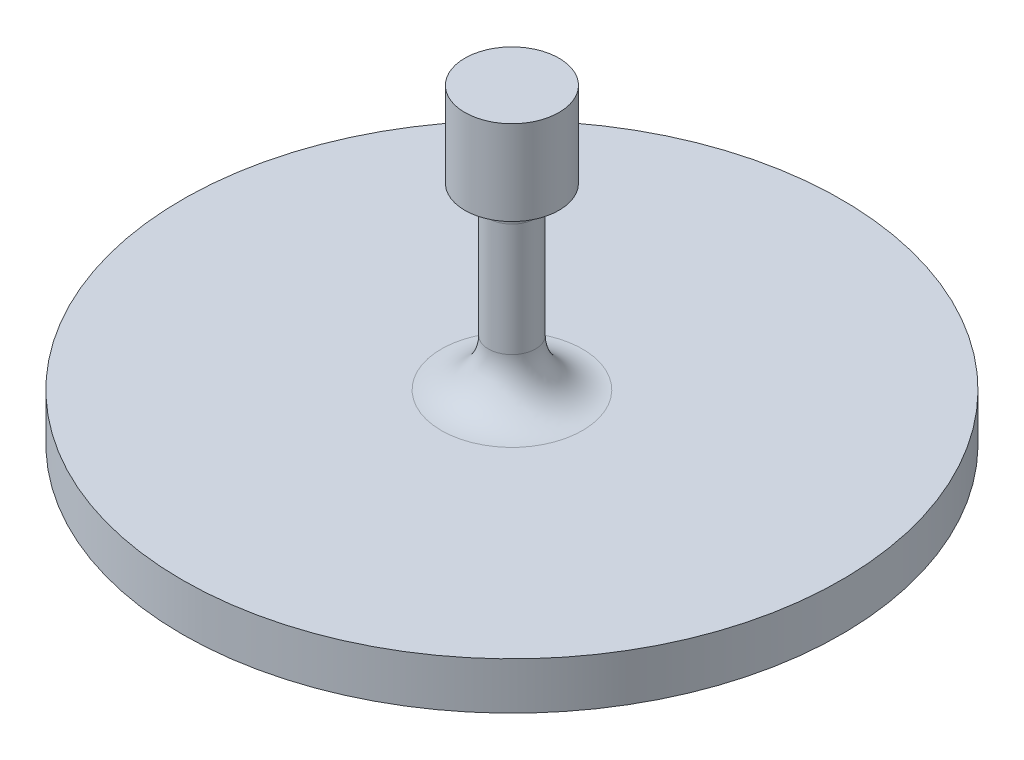
ISO-10303-21;
HEADER;
FILE_DESCRIPTION(('STEP AP214'),'2;1');
FILE_NAME('part.step','',(''),(''),'','','');
FILE_SCHEMA(('AUTOMOTIVE_DESIGN { 1 0 10303 214 1 1 1 1 }'));
ENDSEC;
DATA;
#1=APPLICATION_CONTEXT('core data for automotive mechanical design processes');
#2=APPLICATION_PROTOCOL_DEFINITION('international standard','automotive_design',2000,#1);
#3=PRODUCT_CONTEXT('',#1,'mechanical');
#4=PRODUCT('Part','Part','',(#3));
#5=PRODUCT_RELATED_PRODUCT_CATEGORY('part','',(#4));
#6=PRODUCT_DEFINITION_FORMATION('','',#4);
#7=PRODUCT_DEFINITION_CONTEXT('part definition',#1,'design');
#8=PRODUCT_DEFINITION('design','',#6,#7);
#9=PRODUCT_DEFINITION_SHAPE('','',#8);
#10=(LENGTH_UNIT() NAMED_UNIT(*) SI_UNIT(.MILLI.,.METRE.));
#11=(NAMED_UNIT(*) PLANE_ANGLE_UNIT() SI_UNIT($,.RADIAN.));
#12=(NAMED_UNIT(*) SI_UNIT($,.STERADIAN.) SOLID_ANGLE_UNIT());
#13=UNCERTAINTY_MEASURE_WITH_UNIT(LENGTH_MEASURE(1.E-05),#10,'distance_accuracy_value','');
#14=(GEOMETRIC_REPRESENTATION_CONTEXT(3) GLOBAL_UNCERTAINTY_ASSIGNED_CONTEXT((#13)) GLOBAL_UNIT_ASSIGNED_CONTEXT((#10,
#11,#12)) REPRESENTATION_CONTEXT('',''));
#15=CARTESIAN_POINT('',(0.,0.,0.));
#16=DIRECTION('',(0.,0.,1.));
#17=DIRECTION('',(1.,0.,0.));
#18=AXIS2_PLACEMENT_3D('',#15,#16,#17);
#19=CARTESIAN_POINT('',(0.,5.,0.));
#20=DIRECTION('',(0.,-1.,0.));
#21=DIRECTION('',(0.,0.,-1.));
#22=AXIS2_PLACEMENT_3D('',#19,#20,#21);
#23=CYLINDRICAL_SURFACE('',#22,35.);
#24=CARTESIAN_POINT('',(0.,5.,0.));
#25=DIRECTION('',(0.,1.,0.));
#26=DIRECTION('',(0.,0.,1.));
#27=AXIS2_PLACEMENT_3D('',#24,#25,#26);
#28=CIRCLE('',#27,35.);
#29=CARTESIAN_POINT('',(0.,5.,35.));
#30=VERTEX_POINT('',#29);
#31=EDGE_CURVE('E61',#30,#30,#28,.T.);
#32=ORIENTED_EDGE('',*,*,#31,.F.);
#33=EDGE_LOOP('',(#32));
#34=FACE_BOUND('',#33,.T.);
#35=CARTESIAN_POINT('',(0.,0.,0.));
#36=DIRECTION('',(0.,1.,0.));
#37=DIRECTION('',(0.,0.,1.));
#38=AXIS2_PLACEMENT_3D('',#35,#36,#37);
#39=CIRCLE('',#38,35.);
#40=CARTESIAN_POINT('',(0.,0.,35.));
#41=VERTEX_POINT('',#40);
#42=EDGE_CURVE('E62',#41,#41,#39,.T.);
#43=ORIENTED_EDGE('',*,*,#42,.T.);
#44=EDGE_LOOP('',(#43));
#45=FACE_BOUND('',#44,.T.);
#46=ADVANCED_FACE('F41',(#34,#45),#23,.T.);
#47=CARTESIAN_POINT('',(0.,5.,0.));
#48=DIRECTION('',(0.,1.,0.));
#49=DIRECTION('',(0.,0.,1.));
#50=AXIS2_PLACEMENT_3D('',#47,#48,#49);
#51=PLANE('',#50);
#52=CARTESIAN_POINT('',(0.,5.,0.));
#53=DIRECTION('',(0.,1.,0.));
#54=DIRECTION('',(0.,0.,1.));
#55=AXIS2_PLACEMENT_3D('',#52,#53,#54);
#56=CIRCLE('',#55,7.5);
#57=CARTESIAN_POINT('',(0.,5.,7.5));
#58=VERTEX_POINT('',#57);
#59=EDGE_CURVE('E52',#58,#58,#56,.F.);
#60=ORIENTED_EDGE('',*,*,#59,.T.);
#61=EDGE_LOOP('',(#60));
#62=FACE_BOUND('',#61,.T.);
#63=ORIENTED_EDGE('',*,*,#31,.T.);
#64=EDGE_LOOP('',(#63));
#65=FACE_BOUND('',#64,.T.);
#66=ADVANCED_FACE('F96',(#62,#65),#51,.T.);
#67=CARTESIAN_POINT('',(0.,0.,0.));
#68=DIRECTION('',(0.,1.,0.));
#69=DIRECTION('',(0.,0.,1.));
#70=AXIS2_PLACEMENT_3D('',#67,#68,#69);
#71=PLANE('',#70);
#72=ORIENTED_EDGE('',*,*,#42,.F.);
#73=EDGE_LOOP('',(#72));
#74=FACE_BOUND('',#73,.T.);
#75=ADVANCED_FACE('F103',(#74),#71,.F.);
#76=CARTESIAN_POINT('',(0.,24.,0.));
#77=DIRECTION('',(0.,-1.,0.));
#78=DIRECTION('',(0.,0.,-1.));
#79=AXIS2_PLACEMENT_3D('',#76,#77,#78);
#80=CYLINDRICAL_SURFACE('',#79,2.5);
#81=CARTESIAN_POINT('',(0.,22.,0.));
#82=DIRECTION('',(0.,1.,0.));
#83=DIRECTION('',(0.,0.,1.));
#84=AXIS2_PLACEMENT_3D('',#81,#82,#83);
#85=CIRCLE('',#84,2.5);
#86=CARTESIAN_POINT('',(0.,22.,2.5));
#87=VERTEX_POINT('',#86);
#88=EDGE_CURVE('E10',#87,#87,#85,.F.);
#89=ORIENTED_EDGE('',*,*,#88,.T.);
#90=EDGE_LOOP('',(#89));
#91=FACE_BOUND('',#90,.T.);
#92=CARTESIAN_POINT('',(0.,10.,0.));
#93=DIRECTION('',(0.,1.,0.));
#94=DIRECTION('',(0.,0.,1.));
#95=AXIS2_PLACEMENT_3D('',#92,#93,#94);
#96=CIRCLE('',#95,2.5);
#97=CARTESIAN_POINT('',(0.,10.,2.5));
#98=VERTEX_POINT('',#97);
#99=EDGE_CURVE('E56',#98,#98,#96,.T.);
#100=ORIENTED_EDGE('',*,*,#99,.T.);
#101=EDGE_LOOP('',(#100));
#102=FACE_BOUND('',#101,.T.);
#103=ADVANCED_FACE('F79',(#91,#102),#80,.T.);
#104=CARTESIAN_POINT('',(0.,33.,0.));
#105=DIRECTION('',(0.,-1.,0.));
#106=DIRECTION('',(0.,0.,-1.));
#107=AXIS2_PLACEMENT_3D('',#104,#105,#106);
#108=CYLINDRICAL_SURFACE('',#107,5.);
#109=CARTESIAN_POINT('',(0.,33.,0.));
#110=DIRECTION('',(0.,1.,0.));
#111=DIRECTION('',(0.,0.,1.));
#112=AXIS2_PLACEMENT_3D('',#109,#110,#111);
#113=CIRCLE('',#112,5.);
#114=CARTESIAN_POINT('',(0.,33.,5.));
#115=VERTEX_POINT('',#114);
#116=EDGE_CURVE('E65',#115,#115,#113,.T.);
#117=ORIENTED_EDGE('',*,*,#116,.F.);
#118=EDGE_LOOP('',(#117));
#119=FACE_BOUND('',#118,.T.);
#120=CARTESIAN_POINT('',(0.,24.,0.));
#121=DIRECTION('',(0.,1.,0.));
#122=DIRECTION('',(0.,0.,1.));
#123=AXIS2_PLACEMENT_3D('',#120,#121,#122);
#124=CIRCLE('',#123,5.);
#125=CARTESIAN_POINT('',(0.,24.,5.));
#126=VERTEX_POINT('',#125);
#127=EDGE_CURVE('E68',#126,#126,#124,.T.);
#128=ORIENTED_EDGE('',*,*,#127,.T.);
#129=EDGE_LOOP('',(#128));
#130=FACE_BOUND('',#129,.T.);
#131=ADVANCED_FACE('F76',(#119,#130),#108,.T.);
#132=CARTESIAN_POINT('',(0.,33.,0.));
#133=DIRECTION('',(0.,1.,0.));
#134=DIRECTION('',(0.,0.,1.));
#135=AXIS2_PLACEMENT_3D('',#132,#133,#134);
#136=PLANE('',#135);
#137=ORIENTED_EDGE('',*,*,#116,.T.);
#138=EDGE_LOOP('',(#137));
#139=FACE_BOUND('',#138,.T.);
#140=ADVANCED_FACE('F74',(#139),#136,.T.);
#141=CARTESIAN_POINT('',(0.,24.,0.));
#142=DIRECTION('',(0.,1.,0.));
#143=DIRECTION('',(0.,0.,1.));
#144=AXIS2_PLACEMENT_3D('',#141,#142,#143);
#145=PLANE('',#144);
#146=CARTESIAN_POINT('',(0.,24.,0.));
#147=DIRECTION('',(0.,1.,0.));
#148=DIRECTION('',(0.,0.,1.));
#149=AXIS2_PLACEMENT_3D('',#146,#147,#148);
#150=CIRCLE('',#149,4.5);
#151=CARTESIAN_POINT('',(0.,24.,4.5));
#152=VERTEX_POINT('',#151);
#153=EDGE_CURVE('E48',#152,#152,#150,.T.);
#154=ORIENTED_EDGE('',*,*,#153,.T.);
#155=EDGE_LOOP('',(#154));
#156=FACE_BOUND('',#155,.T.);
#157=ORIENTED_EDGE('',*,*,#127,.F.);
#158=EDGE_LOOP('',(#157));
#159=FACE_BOUND('',#158,.T.);
#160=ADVANCED_FACE('F83',(#156,#159),#145,.F.);
#161=CARTESIAN_POINT('',(0.,10.,0.));
#162=DIRECTION('',(0.,1.,0.));
#163=DIRECTION('',(0.,0.,1.));
#164=AXIS2_PLACEMENT_3D('',#161,#162,#163);
#165=TOROIDAL_SURFACE('',#164,7.5,5.);
#166=ORIENTED_EDGE('',*,*,#59,.F.);
#167=EDGE_LOOP('',(#166));
#168=FACE_BOUND('',#167,.T.);
#169=ORIENTED_EDGE('',*,*,#99,.F.);
#170=EDGE_LOOP('',(#169));
#171=FACE_BOUND('',#170,.T.);
#172=ADVANCED_FACE('F85',(#168,#171),#165,.F.);
#173=CARTESIAN_POINT('',(0.,22.,0.));
#174=DIRECTION('',(0.,1.,0.));
#175=DIRECTION('',(0.,0.,1.));
#176=AXIS2_PLACEMENT_3D('',#173,#174,#175);
#177=TOROIDAL_SURFACE('',#176,4.5,2.);
#178=ORIENTED_EDGE('',*,*,#88,.F.);
#179=EDGE_LOOP('',(#178));
#180=FACE_BOUND('',#179,.T.);
#181=ORIENTED_EDGE('',*,*,#153,.F.);
#182=EDGE_LOOP('',(#181));
#183=FACE_BOUND('',#182,.T.);
#184=ADVANCED_FACE('F43',(#180,#183),#177,.F.);
#185=CLOSED_SHELL('',(#46,#66,#75,#103,#131,#140,#160,#172,#184));
#186=MANIFOLD_SOLID_BREP('B2',#185);
#187=ADVANCED_BREP_SHAPE_REPRESENTATION('',(#18,#186),#14);
#188=SHAPE_DEFINITION_REPRESENTATION(#9,#187);
ENDSEC;
END-ISO-10303-21;
